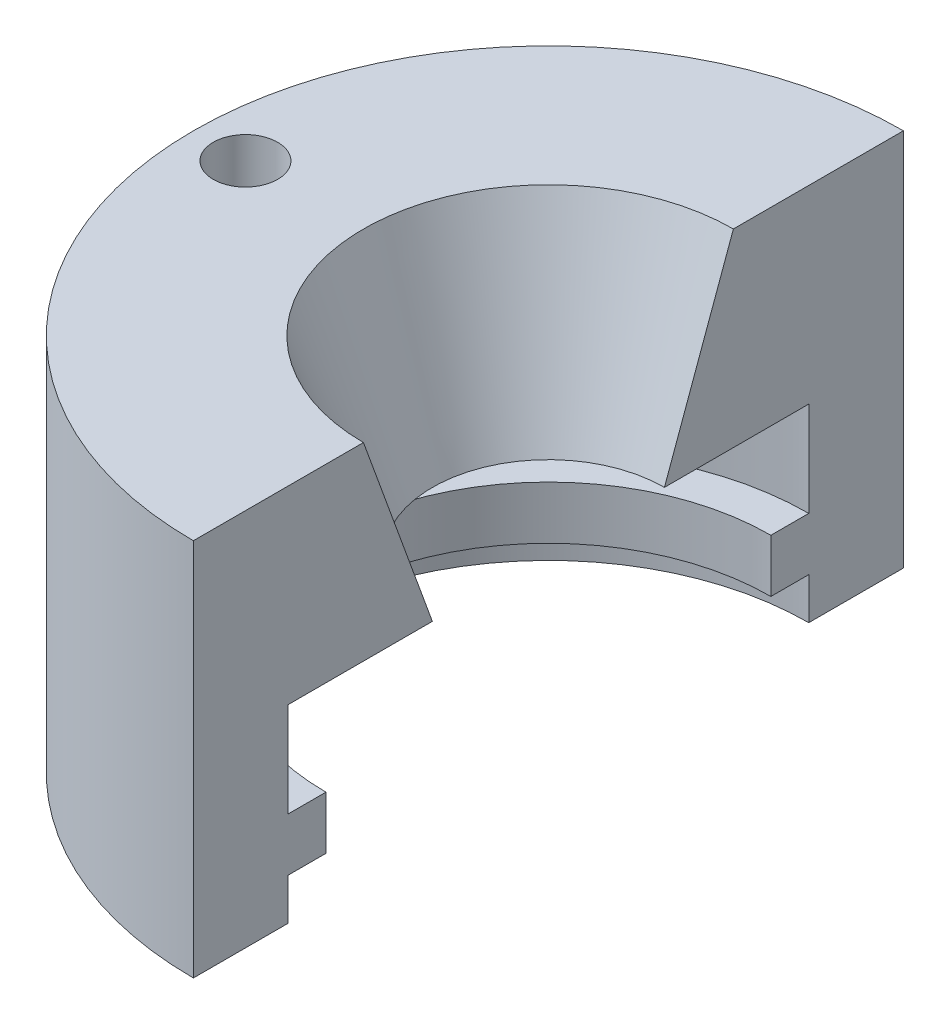
ISO-10303-21;
HEADER;
FILE_DESCRIPTION(('STEP AP214'),'2;1');
FILE_NAME('part.step','',(''),(''),'','','');
FILE_SCHEMA(('AUTOMOTIVE_DESIGN { 1 0 10303 214 1 1 1 1 }'));
ENDSEC;
DATA;
#1=APPLICATION_CONTEXT('core data for automotive mechanical design processes');
#2=APPLICATION_PROTOCOL_DEFINITION('international standard','automotive_design',2000,#1);
#3=PRODUCT_CONTEXT('',#1,'mechanical');
#4=PRODUCT('Part','Part','',(#3));
#5=PRODUCT_RELATED_PRODUCT_CATEGORY('part','',(#4));
#6=PRODUCT_DEFINITION_FORMATION('','',#4);
#7=PRODUCT_DEFINITION_CONTEXT('part definition',#1,'design');
#8=PRODUCT_DEFINITION('design','',#6,#7);
#9=PRODUCT_DEFINITION_SHAPE('','',#8);
#10=(LENGTH_UNIT() NAMED_UNIT(*) SI_UNIT(.MILLI.,.METRE.));
#11=(NAMED_UNIT(*) PLANE_ANGLE_UNIT() SI_UNIT($,.RADIAN.));
#12=(NAMED_UNIT(*) SI_UNIT($,.STERADIAN.) SOLID_ANGLE_UNIT());
#13=UNCERTAINTY_MEASURE_WITH_UNIT(LENGTH_MEASURE(1.E-05),#10,'distance_accuracy_value','');
#14=(GEOMETRIC_REPRESENTATION_CONTEXT(3) GLOBAL_UNCERTAINTY_ASSIGNED_CONTEXT((#13)) GLOBAL_UNIT_ASSIGNED_CONTEXT((#10,
#11,#12)) REPRESENTATION_CONTEXT('',''));
#15=CARTESIAN_POINT('',(0.,0.,0.));
#16=DIRECTION('',(0.,0.,1.));
#17=DIRECTION('',(1.,0.,0.));
#18=AXIS2_PLACEMENT_3D('',#15,#16,#17);
#19=CARTESIAN_POINT('',(0.,-8.06942115721387,-18.75));
#20=DIRECTION('',(-1.,0.,0.));
#21=DIRECTION('',(0.,0.,1.));
#22=AXIS2_PLACEMENT_3D('',#19,#20,#21);
#23=PLANE('',#22);
#24=DIRECTION('',(0.,-1.,0.));
#25=VECTOR('',#24,1.);
#26=CARTESIAN_POINT('',(0.,0.,-18.75));
#27=LINE('',#26,#25);
#28=CARTESIAN_POINT('',(0.,11.9405788427861,-18.75));
#29=VERTEX_POINT('',#28);
#30=CARTESIAN_POINT('',(0.,-8.05942115721387,-18.75));
#31=VERTEX_POINT('',#30);
#32=EDGE_CURVE('E169',#29,#31,#27,.T.);
#33=ORIENTED_EDGE('',*,*,#32,.F.);
#34=DIRECTION('',(0.,0.,-1.));
#35=VECTOR('',#34,1.);
#36=CARTESIAN_POINT('',(0.,11.9405788427861,18.75));
#37=LINE('',#36,#35);
#38=CARTESIAN_POINT('',(0.,11.9405788427861,-9.76805788761378));
#39=VERTEX_POINT('',#38);
#40=EDGE_CURVE('E163',#39,#29,#37,.T.);
#41=ORIENTED_EDGE('',*,*,#40,.F.);
#42=DIRECTION('',(0.,-0.93969262078591,0.342020143325663));
#43=VECTOR('',#42,1.);
#44=CARTESIAN_POINT('',(0.,-14.8969396353588,0.));
#45=LINE('',#44,#43);
#46=CARTESIAN_POINT('',(0.,1.94057884278613,-6.12835554495182));
#47=VERTEX_POINT('',#46);
#48=EDGE_CURVE('E39',#47,#39,#45,.F.);
#49=ORIENTED_EDGE('',*,*,#48,.F.);
#50=DIRECTION('',(0.,0.,1.));
#51=VECTOR('',#50,1.);
#52=CARTESIAN_POINT('',(0.,1.94057884278613,6.12835554495182));
#53=LINE('',#52,#51);
#54=CARTESIAN_POINT('',(0.,1.94057884278613,-13.75));
#55=VERTEX_POINT('',#54);
#56=EDGE_CURVE('E178',#55,#47,#53,.T.);
#57=ORIENTED_EDGE('',*,*,#56,.F.);
#58=DIRECTION('',(0.,-1.,0.));
#59=VECTOR('',#58,1.);
#60=CARTESIAN_POINT('',(0.,0.,-13.75));
#61=LINE('',#60,#59);
#62=CARTESIAN_POINT('',(0.,-3.05942115721387,-13.75));
#63=VERTEX_POINT('',#62);
#64=EDGE_CURVE('E177',#63,#55,#61,.F.);
#65=ORIENTED_EDGE('',*,*,#64,.F.);
#66=DIRECTION('',(0.,0.,-1.));
#67=VECTOR('',#66,1.);
#68=CARTESIAN_POINT('',(0.,-3.05942115721387,13.75));
#69=LINE('',#68,#67);
#70=CARTESIAN_POINT('',(0.,-3.05942115721387,-11.75));
#71=VERTEX_POINT('',#70);
#72=EDGE_CURVE('E175',#71,#63,#69,.T.);
#73=ORIENTED_EDGE('',*,*,#72,.F.);
#74=DIRECTION('',(0.,-1.,0.));
#75=VECTOR('',#74,1.);
#76=CARTESIAN_POINT('',(0.,0.,-11.75));
#77=LINE('',#76,#75);
#78=CARTESIAN_POINT('',(0.,-5.85942115721387,-11.75));
#79=VERTEX_POINT('',#78);
#80=EDGE_CURVE('E126',#79,#71,#77,.F.);
#81=ORIENTED_EDGE('',*,*,#80,.F.);
#82=DIRECTION('',(0.,0.,1.));
#83=VECTOR('',#82,1.);
#84=CARTESIAN_POINT('',(0.,-5.85942115721387,11.75));
#85=LINE('',#84,#83);
#86=CARTESIAN_POINT('',(0.,-5.85942115721387,-13.75));
#87=VERTEX_POINT('',#86);
#88=EDGE_CURVE('E124',#87,#79,#85,.T.);
#89=ORIENTED_EDGE('',*,*,#88,.F.);
#90=DIRECTION('',(0.,-1.,0.));
#91=VECTOR('',#90,1.);
#92=CARTESIAN_POINT('',(0.,0.,-13.75));
#93=LINE('',#92,#91);
#94=CARTESIAN_POINT('',(0.,-8.05942115721387,-13.75));
#95=VERTEX_POINT('',#94);
#96=EDGE_CURVE('E113',#95,#87,#93,.F.);
#97=ORIENTED_EDGE('',*,*,#96,.F.);
#98=DIRECTION('',(0.,0.,1.));
#99=VECTOR('',#98,1.);
#100=CARTESIAN_POINT('',(0.,-8.05942115721387,13.75));
#101=LINE('',#100,#99);
#102=EDGE_CURVE('E11',#31,#95,#101,.T.);
#103=ORIENTED_EDGE('',*,*,#102,.F.);
#104=EDGE_LOOP('',(#33,#41,#49,#57,#65,#73,#81,#89,#97,#103));
#105=FACE_BOUND('',#104,.T.);
#106=ADVANCED_FACE('F36',(#105),#23,.F.);
#107=DIRECTION('',(0.,-1.,0.));
#108=VECTOR('',#107,1.);
#109=CARTESIAN_POINT('',(0.,0.,13.75));
#110=LINE('',#109,#108);
#111=CARTESIAN_POINT('',(0.,-5.85942115721387,13.75));
#112=VERTEX_POINT('',#111);
#113=CARTESIAN_POINT('',(0.,-8.05942115721387,13.75));
#114=VERTEX_POINT('',#113);
#115=EDGE_CURVE('E121',#112,#114,#110,.T.);
#116=ORIENTED_EDGE('',*,*,#115,.F.);
#117=CARTESIAN_POINT('',(0.,-5.85942115721387,11.75));
#118=VERTEX_POINT('',#117);
#119=EDGE_CURVE('E120',#118,#112,#85,.T.);
#120=ORIENTED_EDGE('',*,*,#119,.F.);
#121=DIRECTION('',(0.,-1.,0.));
#122=VECTOR('',#121,1.);
#123=CARTESIAN_POINT('',(0.,0.,11.75));
#124=LINE('',#123,#122);
#125=CARTESIAN_POINT('',(0.,-3.05942115721387,11.75));
#126=VERTEX_POINT('',#125);
#127=EDGE_CURVE('E130',#126,#118,#124,.T.);
#128=ORIENTED_EDGE('',*,*,#127,.F.);
#129=CARTESIAN_POINT('',(0.,-3.05942115721387,13.75));
#130=VERTEX_POINT('',#129);
#131=EDGE_CURVE('E172',#130,#126,#69,.T.);
#132=ORIENTED_EDGE('',*,*,#131,.F.);
#133=DIRECTION('',(0.,-1.,0.));
#134=VECTOR('',#133,1.);
#135=CARTESIAN_POINT('',(0.,0.,13.75));
#136=LINE('',#135,#134);
#137=CARTESIAN_POINT('',(0.,1.94057884278613,13.75));
#138=VERTEX_POINT('',#137);
#139=EDGE_CURVE('E174',#138,#130,#136,.T.);
#140=ORIENTED_EDGE('',*,*,#139,.F.);
#141=CARTESIAN_POINT('',(0.,1.94057884278613,6.12835554495182));
#142=VERTEX_POINT('',#141);
#143=EDGE_CURVE('E180',#142,#138,#53,.T.);
#144=ORIENTED_EDGE('',*,*,#143,.F.);
#145=DIRECTION('',(0.,0.93969262078591,0.342020143325663));
#146=VECTOR('',#145,1.);
#147=CARTESIAN_POINT('',(0.,-14.8969396353588,0.));
#148=LINE('',#147,#146);
#149=CARTESIAN_POINT('',(0.,11.9405788427861,9.76805788761378));
#150=VERTEX_POINT('',#149);
#151=EDGE_CURVE('E166',#150,#142,#148,.F.);
#152=ORIENTED_EDGE('',*,*,#151,.F.);
#153=CARTESIAN_POINT('',(0.,11.9405788427861,18.75));
#154=VERTEX_POINT('',#153);
#155=EDGE_CURVE('E165',#154,#150,#37,.T.);
#156=ORIENTED_EDGE('',*,*,#155,.F.);
#157=DIRECTION('',(0.,-1.,0.));
#158=VECTOR('',#157,1.);
#159=CARTESIAN_POINT('',(0.,0.,18.75));
#160=LINE('',#159,#158);
#161=CARTESIAN_POINT('',(0.,-8.05942115721387,18.75));
#162=VERTEX_POINT('',#161);
#163=EDGE_CURVE('E167',#162,#154,#160,.F.);
#164=ORIENTED_EDGE('',*,*,#163,.F.);
#165=EDGE_CURVE('E44',#114,#162,#101,.T.);
#166=ORIENTED_EDGE('',*,*,#165,.F.);
#167=EDGE_LOOP('',(#116,#120,#128,#132,#140,#144,#152,#156,#164,#166));
#168=FACE_BOUND('',#167,.T.);
#169=ADVANCED_FACE('F194',(#168),#23,.F.);
#170=CARTESIAN_POINT('',(-16.,-3.05942115721387,0.));
#171=DIRECTION('',(0.,-1.,0.));
#172=DIRECTION('',(0.,0.,-1.));
#173=AXIS2_PLACEMENT_3D('',#170,#171,#172);
#174=PLANE('',#173);
#175=CARTESIAN_POINT('',(-16.,-3.05942115721387,0.));
#176=DIRECTION('',(0.,-1.,0.));
#177=DIRECTION('',(0.,0.,-1.));
#178=AXIS2_PLACEMENT_3D('',#175,#176,#177);
#179=CIRCLE('',#178,1.7);
#180=CARTESIAN_POINT('',(-16.,-3.05942115721387,-1.7));
#181=VERTEX_POINT('',#180);
#182=EDGE_CURVE('E139',#181,#181,#179,.T.);
#183=ORIENTED_EDGE('',*,*,#182,.T.);
#184=EDGE_LOOP('',(#183));
#185=FACE_BOUND('',#184,.T.);
#186=ADVANCED_FACE('F214',(#185),#174,.T.);
#187=CARTESIAN_POINT('',(-16.,6.94057884278613,0.));
#188=DIRECTION('',(0.,1.,0.));
#189=DIRECTION('',(0.,0.,1.));
#190=AXIS2_PLACEMENT_3D('',#187,#188,#189);
#191=PLANE('',#190);
#192=CARTESIAN_POINT('',(-16.,6.94057884278613,0.));
#193=DIRECTION('',(0.,1.,0.));
#194=DIRECTION('',(0.,0.,1.));
#195=AXIS2_PLACEMENT_3D('',#192,#193,#194);
#196=CIRCLE('',#195,1.7);
#197=CARTESIAN_POINT('',(-16.,6.94057884278613,1.7));
#198=VERTEX_POINT('',#197);
#199=EDGE_CURVE('E280',#198,#198,#196,.T.);
#200=ORIENTED_EDGE('',*,*,#199,.T.);
#201=EDGE_LOOP('',(#200));
#202=FACE_BOUND('',#201,.T.);
#203=ADVANCED_FACE('F218',(#202),#191,.T.);
#204=CARTESIAN_POINT('',(-16.,-3.05942115721387,0.));
#205=DIRECTION('',(0.,-1.,0.));
#206=DIRECTION('',(0.,0.,-1.));
#207=AXIS2_PLACEMENT_3D('',#204,#205,#206);
#208=CYLINDRICAL_SURFACE('',#207,1.7);
#209=ORIENTED_EDGE('',*,*,#182,.F.);
#210=EDGE_LOOP('',(#209));
#211=FACE_BOUND('',#210,.T.);
#212=CARTESIAN_POINT('',(-16.,-8.05942115721387,0.));
#213=DIRECTION('',(0.,-1.,0.));
#214=DIRECTION('',(0.,0.,-1.));
#215=AXIS2_PLACEMENT_3D('',#212,#213,#214);
#216=CIRCLE('',#215,1.7);
#217=CARTESIAN_POINT('',(-16.,-8.05942115721387,-1.7));
#218=VERTEX_POINT('',#217);
#219=EDGE_CURVE('E276',#218,#218,#216,.T.);
#220=ORIENTED_EDGE('',*,*,#219,.T.);
#221=EDGE_LOOP('',(#220));
#222=FACE_BOUND('',#221,.T.);
#223=ADVANCED_FACE('F230',(#211,#222),#208,.F.);
#224=CARTESIAN_POINT('',(0.,0.,0.));
#225=DIRECTION('',(0.,-1.,0.));
#226=DIRECTION('',(0.,0.,-1.));
#227=AXIS2_PLACEMENT_3D('',#224,#225,#226);
#228=CYLINDRICAL_SURFACE('',#227,18.75);
#229=CARTESIAN_POINT('',(0.,11.9405788427861,0.));
#230=DIRECTION('',(0.,-1.,0.));
#231=DIRECTION('',(0.,0.,-1.));
#232=AXIS2_PLACEMENT_3D('',#229,#230,#231);
#233=CIRCLE('',#232,18.75);
#234=EDGE_CURVE('E157',#154,#29,#233,.T.);
#235=ORIENTED_EDGE('',*,*,#234,.T.);
#236=ORIENTED_EDGE('',*,*,#32,.T.);
#237=CARTESIAN_POINT('',(0.,-8.05942115721387,0.));
#238=DIRECTION('',(0.,-1.,0.));
#239=DIRECTION('',(0.,0.,-1.));
#240=AXIS2_PLACEMENT_3D('',#237,#238,#239);
#241=CIRCLE('',#240,18.75);
#242=EDGE_CURVE('E160',#162,#31,#241,.T.);
#243=ORIENTED_EDGE('',*,*,#242,.F.);
#244=ORIENTED_EDGE('',*,*,#163,.T.);
#245=EDGE_LOOP('',(#235,#236,#243,#244));
#246=FACE_BOUND('',#245,.T.);
#247=ADVANCED_FACE('F240',(#246),#228,.T.);
#248=CARTESIAN_POINT('',(-16.,6.94057884278613,0.));
#249=DIRECTION('',(0.,1.,0.));
#250=DIRECTION('',(0.,0.,1.));
#251=AXIS2_PLACEMENT_3D('',#248,#249,#250);
#252=CYLINDRICAL_SURFACE('',#251,1.7);
#253=ORIENTED_EDGE('',*,*,#199,.F.);
#254=EDGE_LOOP('',(#253));
#255=FACE_BOUND('',#254,.T.);
#256=CARTESIAN_POINT('',(-16.,11.9405788427861,0.));
#257=DIRECTION('',(0.,1.,0.));
#258=DIRECTION('',(0.,0.,1.));
#259=AXIS2_PLACEMENT_3D('',#256,#257,#258);
#260=CIRCLE('',#259,1.7);
#261=CARTESIAN_POINT('',(-16.,11.9405788427861,1.7));
#262=VERTEX_POINT('',#261);
#263=EDGE_CURVE('E277',#262,#262,#260,.T.);
#264=ORIENTED_EDGE('',*,*,#263,.T.);
#265=EDGE_LOOP('',(#264));
#266=FACE_BOUND('',#265,.T.);
#267=ADVANCED_FACE('F254',(#255,#266),#252,.F.);
#268=CARTESIAN_POINT('',(0.,11.9405788427861,18.75));
#269=DIRECTION('',(0.,-1.,0.));
#270=DIRECTION('',(0.,0.,-1.));
#271=AXIS2_PLACEMENT_3D('',#268,#269,#270);
#272=PLANE('',#271);
#273=ORIENTED_EDGE('',*,*,#263,.F.);
#274=EDGE_LOOP('',(#273));
#275=FACE_BOUND('',#274,.T.);
#276=ORIENTED_EDGE('',*,*,#234,.F.);
#277=ORIENTED_EDGE('',*,*,#155,.T.);
#278=CARTESIAN_POINT('',(0.,11.9405788427861,0.));
#279=DIRECTION('',(0.,-1.,0.));
#280=DIRECTION('',(0.,0.,-1.));
#281=AXIS2_PLACEMENT_3D('',#278,#279,#280);
#282=CIRCLE('',#281,9.76805788761378);
#283=EDGE_CURVE('E154',#150,#39,#282,.T.);
#284=ORIENTED_EDGE('',*,*,#283,.T.);
#285=ORIENTED_EDGE('',*,*,#40,.T.);
#286=EDGE_LOOP('',(#276,#277,#284,#285));
#287=FACE_BOUND('',#286,.T.);
#288=ADVANCED_FACE('F247',(#275,#287),#272,.F.);
#289=CARTESIAN_POINT('',(0.,1.94057884278613,0.));
#290=DIRECTION('',(0.,1.,0.));
#291=DIRECTION('',(0.,0.,1.));
#292=AXIS2_PLACEMENT_3D('',#289,#290,#291);
#293=CONICAL_SURFACE('',#292,6.12835554495182,0.34906585039886);
#294=ORIENTED_EDGE('',*,*,#283,.F.);
#295=ORIENTED_EDGE('',*,*,#151,.T.);
#296=CARTESIAN_POINT('',(0.,1.94057884278613,0.));
#297=DIRECTION('',(0.,-1.,0.));
#298=DIRECTION('',(0.,0.,-1.));
#299=AXIS2_PLACEMENT_3D('',#296,#297,#298);
#300=CIRCLE('',#299,6.12835554495182);
#301=EDGE_CURVE('E151',#142,#47,#300,.T.);
#302=ORIENTED_EDGE('',*,*,#301,.T.);
#303=ORIENTED_EDGE('',*,*,#48,.T.);
#304=EDGE_LOOP('',(#294,#295,#302,#303));
#305=FACE_BOUND('',#304,.T.);
#306=ADVANCED_FACE('F208',(#305),#293,.F.);
#307=CARTESIAN_POINT('',(0.,1.94057884278613,6.12835554495182));
#308=DIRECTION('',(0.,1.,0.));
#309=DIRECTION('',(0.,0.,1.));
#310=AXIS2_PLACEMENT_3D('',#307,#308,#309);
#311=PLANE('',#310);
#312=CARTESIAN_POINT('',(0.,1.94057884278613,0.));
#313=DIRECTION('',(0.,-1.,0.));
#314=DIRECTION('',(0.,0.,-1.));
#315=AXIS2_PLACEMENT_3D('',#312,#313,#314);
#316=CIRCLE('',#315,13.75);
#317=EDGE_CURVE('E148',#138,#55,#316,.T.);
#318=ORIENTED_EDGE('',*,*,#317,.T.);
#319=ORIENTED_EDGE('',*,*,#56,.T.);
#320=ORIENTED_EDGE('',*,*,#301,.F.);
#321=ORIENTED_EDGE('',*,*,#143,.T.);
#322=EDGE_LOOP('',(#318,#319,#320,#321));
#323=FACE_BOUND('',#322,.T.);
#324=ADVANCED_FACE('F190',(#323),#311,.F.);
#325=CARTESIAN_POINT('',(0.,0.,0.));
#326=DIRECTION('',(0.,-1.,0.));
#327=DIRECTION('',(0.,0.,-1.));
#328=AXIS2_PLACEMENT_3D('',#325,#326,#327);
#329=CYLINDRICAL_SURFACE('',#328,13.75);
#330=CARTESIAN_POINT('',(0.,-3.05942115721387,0.));
#331=DIRECTION('',(0.,-1.,0.));
#332=DIRECTION('',(0.,0.,-1.));
#333=AXIS2_PLACEMENT_3D('',#330,#331,#332);
#334=CIRCLE('',#333,13.75);
#335=EDGE_CURVE('E145',#130,#63,#334,.T.);
#336=ORIENTED_EDGE('',*,*,#335,.T.);
#337=ORIENTED_EDGE('',*,*,#64,.T.);
#338=ORIENTED_EDGE('',*,*,#317,.F.);
#339=ORIENTED_EDGE('',*,*,#139,.T.);
#340=EDGE_LOOP('',(#336,#337,#338,#339));
#341=FACE_BOUND('',#340,.T.);
#342=ADVANCED_FACE('F197',(#341),#329,.F.);
#343=CARTESIAN_POINT('',(0.,-3.05942115721387,13.75));
#344=DIRECTION('',(0.,-1.,0.));
#345=DIRECTION('',(0.,0.,-1.));
#346=AXIS2_PLACEMENT_3D('',#343,#344,#345);
#347=PLANE('',#346);
#348=ORIENTED_EDGE('',*,*,#335,.F.);
#349=ORIENTED_EDGE('',*,*,#131,.T.);
#350=CARTESIAN_POINT('',(0.,-3.05942115721387,0.));
#351=DIRECTION('',(0.,-1.,0.));
#352=DIRECTION('',(0.,0.,-1.));
#353=AXIS2_PLACEMENT_3D('',#350,#351,#352);
#354=CIRCLE('',#353,11.75);
#355=EDGE_CURVE('E137',#126,#71,#354,.T.);
#356=ORIENTED_EDGE('',*,*,#355,.T.);
#357=ORIENTED_EDGE('',*,*,#72,.T.);
#358=EDGE_LOOP('',(#348,#349,#356,#357));
#359=FACE_BOUND('',#358,.T.);
#360=ADVANCED_FACE('F199',(#359),#347,.F.);
#361=CARTESIAN_POINT('',(0.,0.,0.));
#362=DIRECTION('',(0.,-1.,0.));
#363=DIRECTION('',(0.,0.,-1.));
#364=AXIS2_PLACEMENT_3D('',#361,#362,#363);
#365=CYLINDRICAL_SURFACE('',#364,11.75);
#366=CARTESIAN_POINT('',(0.,-5.85942115721387,0.));
#367=DIRECTION('',(0.,-1.,0.));
#368=DIRECTION('',(0.,0.,-1.));
#369=AXIS2_PLACEMENT_3D('',#366,#367,#368);
#370=CIRCLE('',#369,11.75);
#371=EDGE_CURVE('E135',#118,#79,#370,.T.);
#372=ORIENTED_EDGE('',*,*,#371,.T.);
#373=ORIENTED_EDGE('',*,*,#80,.T.);
#374=ORIENTED_EDGE('',*,*,#355,.F.);
#375=ORIENTED_EDGE('',*,*,#127,.T.);
#376=EDGE_LOOP('',(#372,#373,#374,#375));
#377=FACE_BOUND('',#376,.T.);
#378=ADVANCED_FACE('F205',(#377),#365,.F.);
#379=CARTESIAN_POINT('',(0.,-5.85942115721387,11.75));
#380=DIRECTION('',(0.,1.,0.));
#381=DIRECTION('',(0.,0.,1.));
#382=AXIS2_PLACEMENT_3D('',#379,#380,#381);
#383=PLANE('',#382);
#384=CARTESIAN_POINT('',(0.,-5.85942115721387,0.));
#385=DIRECTION('',(0.,-1.,0.));
#386=DIRECTION('',(0.,0.,-1.));
#387=AXIS2_PLACEMENT_3D('',#384,#385,#386);
#388=CIRCLE('',#387,13.75);
#389=EDGE_CURVE('E118',#112,#87,#388,.T.);
#390=ORIENTED_EDGE('',*,*,#389,.T.);
#391=ORIENTED_EDGE('',*,*,#88,.T.);
#392=ORIENTED_EDGE('',*,*,#371,.F.);
#393=ORIENTED_EDGE('',*,*,#119,.T.);
#394=EDGE_LOOP('',(#390,#391,#392,#393));
#395=FACE_BOUND('',#394,.T.);
#396=ADVANCED_FACE('F132',(#395),#383,.F.);
#397=CARTESIAN_POINT('',(0.,-8.05942115721387,13.75));
#398=DIRECTION('',(0.,1.,0.));
#399=DIRECTION('',(0.,0.,1.));
#400=AXIS2_PLACEMENT_3D('',#397,#398,#399);
#401=PLANE('',#400);
#402=ORIENTED_EDGE('',*,*,#219,.F.);
#403=EDGE_LOOP('',(#402));
#404=FACE_BOUND('',#403,.T.);
#405=ORIENTED_EDGE('',*,*,#242,.T.);
#406=ORIENTED_EDGE('',*,*,#102,.T.);
#407=CARTESIAN_POINT('',(0.,-8.05942115721387,0.));
#408=DIRECTION('',(0.,-1.,0.));
#409=DIRECTION('',(0.,0.,-1.));
#410=AXIS2_PLACEMENT_3D('',#407,#408,#409);
#411=CIRCLE('',#410,13.75);
#412=EDGE_CURVE('E119',#114,#95,#411,.T.);
#413=ORIENTED_EDGE('',*,*,#412,.F.);
#414=ORIENTED_EDGE('',*,*,#165,.T.);
#415=EDGE_LOOP('',(#405,#406,#413,#414));
#416=FACE_BOUND('',#415,.T.);
#417=ADVANCED_FACE('F222',(#404,#416),#401,.F.);
#418=CARTESIAN_POINT('',(0.,0.,0.));
#419=DIRECTION('',(0.,-1.,0.));
#420=DIRECTION('',(0.,0.,-1.));
#421=AXIS2_PLACEMENT_3D('',#418,#419,#420);
#422=CYLINDRICAL_SURFACE('',#421,13.75);
#423=ORIENTED_EDGE('',*,*,#412,.T.);
#424=ORIENTED_EDGE('',*,*,#96,.T.);
#425=ORIENTED_EDGE('',*,*,#389,.F.);
#426=ORIENTED_EDGE('',*,*,#115,.T.);
#427=EDGE_LOOP('',(#423,#424,#425,#426));
#428=FACE_BOUND('',#427,.T.);
#429=ADVANCED_FACE('F115',(#428),#422,.F.);
#430=CLOSED_SHELL('',(#106,#169,#186,#203,#223,#247,#267,#288,#306,#324,#342,#360,#378,#396,
#417,#429));
#431=MANIFOLD_SOLID_BREP('B2',#430);
#432=ADVANCED_BREP_SHAPE_REPRESENTATION('',(#18,#431),#14);
#433=SHAPE_DEFINITION_REPRESENTATION(#9,#432);
ENDSEC;
END-ISO-10303-21;
